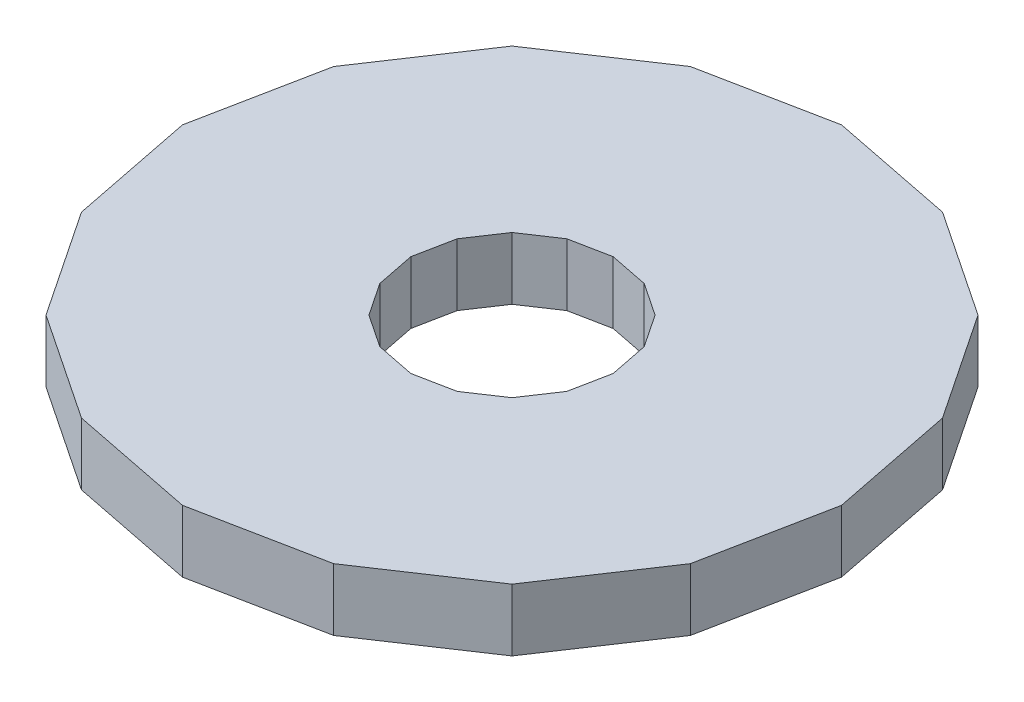
ISO-10303-21;
HEADER;
FILE_DESCRIPTION(('STEP AP214'),'2;1');
FILE_NAME('part.step','',(''),(''),'','','');
FILE_SCHEMA(('AUTOMOTIVE_DESIGN { 1 0 10303 214 1 1 1 1 }'));
ENDSEC;
DATA;
#1=APPLICATION_CONTEXT('core data for automotive mechanical design processes');
#2=APPLICATION_PROTOCOL_DEFINITION('international standard','automotive_design',2000,#1);
#3=PRODUCT_CONTEXT('',#1,'mechanical');
#4=PRODUCT('Part','Part','',(#3));
#5=PRODUCT_RELATED_PRODUCT_CATEGORY('part','',(#4));
#6=PRODUCT_DEFINITION_FORMATION('','',#4);
#7=PRODUCT_DEFINITION_CONTEXT('part definition',#1,'design');
#8=PRODUCT_DEFINITION('design','',#6,#7);
#9=PRODUCT_DEFINITION_SHAPE('','',#8);
#10=(LENGTH_UNIT() NAMED_UNIT(*) SI_UNIT(.MILLI.,.METRE.));
#11=(NAMED_UNIT(*) PLANE_ANGLE_UNIT() SI_UNIT($,.RADIAN.));
#12=(NAMED_UNIT(*) SI_UNIT($,.STERADIAN.) SOLID_ANGLE_UNIT());
#13=UNCERTAINTY_MEASURE_WITH_UNIT(LENGTH_MEASURE(1.E-05),#10,'distance_accuracy_value','');
#14=(GEOMETRIC_REPRESENTATION_CONTEXT(3) GLOBAL_UNCERTAINTY_ASSIGNED_CONTEXT((#13)) GLOBAL_UNIT_ASSIGNED_CONTEXT((#10,
#11,#12)) REPRESENTATION_CONTEXT('',''));
#15=CARTESIAN_POINT('',(0.,0.,0.));
#16=DIRECTION('',(0.,0.,1.));
#17=DIRECTION('',(1.,0.,0.));
#18=AXIS2_PLACEMENT_3D('',#15,#16,#17);
#19=CARTESIAN_POINT('',(0.,19.05,0.));
#20=DIRECTION('',(0.,1.,0.));
#21=DIRECTION('',(0.,0.,1.));
#22=AXIS2_PLACEMENT_3D('',#19,#20,#21);
#23=PLANE('',#22);
#24=DIRECTION('',(0.195090322016117,0.,-0.980785280403233));
#25=VECTOR('',#24,1.);
#26=CARTESIAN_POINT('',(93.2212751998086,19.05,38.6135164894741));
#27=LINE('',#26,#25);
#28=CARTESIAN_POINT('',(93.2212751998086,19.05,38.6135164894741));
#29=VERTEX_POINT('',#28);
#30=CARTESIAN_POINT('',(100.901981177583,19.05,-1.16920370144925E-12));
#31=VERTEX_POINT('',#30);
#32=EDGE_CURVE('E388',#29,#31,#27,.T.);
#33=ORIENTED_EDGE('',*,*,#32,.T.);
#34=DIRECTION('',(-0.19509032201614,0.,-0.980785280403228));
#35=VECTOR('',#34,1.);
#36=CARTESIAN_POINT('',(100.901981177583,19.05,-1.16920370144925E-12));
#37=LINE('',#36,#35);
#38=CARTESIAN_POINT('',(93.2212751998077,19.05,-38.6135164894763));
#39=VERTEX_POINT('',#38);
#40=EDGE_CURVE('E392',#31,#39,#37,.T.);
#41=ORIENTED_EDGE('',*,*,#40,.T.);
#42=DIRECTION('',(-0.555570233019612,0.,-0.831469612302539));
#43=VECTOR('',#42,1.);
#44=CARTESIAN_POINT('',(93.2212751998077,19.05,-38.6135164894763));
#45=LINE('',#44,#43);
#46=CARTESIAN_POINT('',(71.3484751258256,19.05,-71.3484751258272));
#47=VERTEX_POINT('',#46);
#48=EDGE_CURVE('E396',#39,#47,#45,.T.);
#49=ORIENTED_EDGE('',*,*,#48,.T.);
#50=DIRECTION('',(-0.831469612302551,0.,-0.555570233019593));
#51=VECTOR('',#50,1.);
#52=CARTESIAN_POINT('',(71.3484751258256,19.05,-71.3484751258272));
#53=LINE('',#52,#51);
#54=CARTESIAN_POINT('',(38.6135164894742,19.05,-93.2212751998086));
#55=VERTEX_POINT('',#54);
#56=EDGE_CURVE('E398',#47,#55,#53,.T.);
#57=ORIENTED_EDGE('',*,*,#56,.T.);
#58=DIRECTION('',(-0.980785280403233,0.,-0.195090322016117));
#59=VECTOR('',#58,1.);
#60=CARTESIAN_POINT('',(38.6135164894742,19.05,-93.2212751998086));
#61=LINE('',#60,#59);
#62=CARTESIAN_POINT('',(-1.19110857349548E-12,19.05,-100.901981177583));
#63=VERTEX_POINT('',#62);
#64=EDGE_CURVE('E401',#55,#63,#61,.T.);
#65=ORIENTED_EDGE('',*,*,#64,.T.);
#66=DIRECTION('',(-0.980785280403228,0.,0.195090322016139));
#67=VECTOR('',#66,1.);
#68=CARTESIAN_POINT('',(-1.19110857349548E-12,19.05,-100.901981177583));
#69=LINE('',#68,#67);
#70=CARTESIAN_POINT('',(-38.6135164894763,19.05,-93.2212751998077));
#71=VERTEX_POINT('',#70);
#72=EDGE_CURVE('E403',#63,#71,#69,.T.);
#73=ORIENTED_EDGE('',*,*,#72,.T.);
#74=DIRECTION('',(-0.831469612302539,0.,0.555570233019612));
#75=VECTOR('',#74,1.);
#76=CARTESIAN_POINT('',(-38.6135164894763,19.05,-93.2212751998077));
#77=LINE('',#76,#75);
#78=CARTESIAN_POINT('',(-71.3484751258273,19.05,-71.3484751258256));
#79=VERTEX_POINT('',#78);
#80=EDGE_CURVE('E405',#71,#79,#77,.T.);
#81=ORIENTED_EDGE('',*,*,#80,.T.);
#82=DIRECTION('',(-0.555570233019593,0.,0.831469612302552));
#83=VECTOR('',#82,1.);
#84=CARTESIAN_POINT('',(-71.3484751258273,19.05,-71.3484751258256));
#85=LINE('',#84,#83);
#86=CARTESIAN_POINT('',(-93.2212751998086,19.05,-38.6135164894741));
#87=VERTEX_POINT('',#86);
#88=EDGE_CURVE('E407',#79,#87,#85,.T.);
#89=ORIENTED_EDGE('',*,*,#88,.T.);
#90=DIRECTION('',(-0.195090322016117,0.,0.980785280403233));
#91=VECTOR('',#90,1.);
#92=CARTESIAN_POINT('',(-93.2212751998086,19.05,-38.6135164894741));
#93=LINE('',#92,#91);
#94=CARTESIAN_POINT('',(-100.901981177583,19.05,1.17388085276978E-12));
#95=VERTEX_POINT('',#94);
#96=EDGE_CURVE('E409',#87,#95,#93,.T.);
#97=ORIENTED_EDGE('',*,*,#96,.T.);
#98=DIRECTION('',(0.195090322016139,0.,0.980785280403228));
#99=VECTOR('',#98,1.);
#100=CARTESIAN_POINT('',(-100.901981177583,19.05,1.17388085276978E-12));
#101=LINE('',#100,#99);
#102=CARTESIAN_POINT('',(-93.2212751998077,19.05,38.6135164894763));
#103=VERTEX_POINT('',#102);
#104=EDGE_CURVE('E412',#95,#103,#101,.T.);
#105=ORIENTED_EDGE('',*,*,#104,.T.);
#106=DIRECTION('',(0.555570233019612,0.,0.831469612302539));
#107=VECTOR('',#106,1.);
#108=CARTESIAN_POINT('',(-93.2212751998077,19.05,38.6135164894763));
#109=LINE('',#108,#107);
#110=CARTESIAN_POINT('',(-71.3484751258256,19.05,71.3484751258273));
#111=VERTEX_POINT('',#110);
#112=EDGE_CURVE('E414',#103,#111,#109,.T.);
#113=ORIENTED_EDGE('',*,*,#112,.T.);
#114=DIRECTION('',(0.831469612302552,0.,0.555570233019593));
#115=VECTOR('',#114,1.);
#116=CARTESIAN_POINT('',(-71.3484751258256,19.05,71.3484751258273));
#117=LINE('',#116,#115);
#118=CARTESIAN_POINT('',(-38.6135164894741,19.05,93.2212751998086));
#119=VERTEX_POINT('',#118);
#120=EDGE_CURVE('E416',#111,#119,#117,.T.);
#121=ORIENTED_EDGE('',*,*,#120,.T.);
#122=DIRECTION('',(0.980785280403233,0.,0.195090322016117));
#123=VECTOR('',#122,1.);
#124=CARTESIAN_POINT('',(-38.6135164894741,19.05,93.2212751998086));
#125=LINE('',#124,#123);
#126=CARTESIAN_POINT('',(1.13628479833624E-12,19.05,100.901981177583));
#127=VERTEX_POINT('',#126);
#128=EDGE_CURVE('E418',#119,#127,#125,.T.);
#129=ORIENTED_EDGE('',*,*,#128,.T.);
#130=DIRECTION('',(0.980785280403228,0.,-0.19509032201614));
#131=VECTOR('',#130,1.);
#132=CARTESIAN_POINT('',(1.13628479833624E-12,19.05,100.901981177583));
#133=LINE('',#132,#131);
#134=CARTESIAN_POINT('',(38.6135164894763,19.05,93.2212751998078));
#135=VERTEX_POINT('',#134);
#136=EDGE_CURVE('E420',#127,#135,#133,.T.);
#137=ORIENTED_EDGE('',*,*,#136,.T.);
#138=DIRECTION('',(0.831469612302539,0.,-0.555570233019612));
#139=VECTOR('',#138,1.);
#140=CARTESIAN_POINT('',(38.6135164894763,19.05,93.2212751998078));
#141=LINE('',#140,#139);
#142=CARTESIAN_POINT('',(71.3484751258272,19.05,71.3484751258257));
#143=VERTEX_POINT('',#142);
#144=EDGE_CURVE('E423',#135,#143,#141,.T.);
#145=ORIENTED_EDGE('',*,*,#144,.T.);
#146=DIRECTION('',(0.555570233019593,0.,-0.831469612302551));
#147=VECTOR('',#146,1.);
#148=CARTESIAN_POINT('',(71.3484751258272,19.05,71.3484751258257));
#149=LINE('',#148,#147);
#150=EDGE_CURVE('E425',#143,#29,#149,.T.);
#151=ORIENTED_EDGE('',*,*,#150,.T.);
#152=EDGE_LOOP('',(#33,#41,#49,#57,#65,#73,#81,#89,#97,#105,#113,#121,#129,#137,#145,#151));
#153=FACE_BOUND('',#152,.T.);
#154=DIRECTION('',(-0.195090322016139,0.,-0.980785280403228));
#155=VECTOR('',#154,1.);
#156=CARTESIAN_POINT('',(30.9784195476567,19.05,-3.72794111611453E-13));
#157=LINE('',#156,#155);
#158=CARTESIAN_POINT('',(30.9784195476567,19.05,-3.72794111611453E-13));
#159=VERTEX_POINT('',#158);
#160=CARTESIAN_POINT('',(28.6203277696274,19.05,-11.8549279217434));
#161=VERTEX_POINT('',#160);
#162=EDGE_CURVE('E252',#159,#161,#157,.T.);
#163=ORIENTED_EDGE('',*,*,#162,.F.);
#164=DIRECTION('',(0.195090322016117,0.,-0.980785280403233));
#165=VECTOR('',#164,1.);
#166=CARTESIAN_POINT('',(28.6203277696277,19.05,11.8549279217427));
#167=LINE('',#166,#165);
#168=CARTESIAN_POINT('',(28.6203277696277,19.05,11.8549279217427));
#169=VERTEX_POINT('',#168);
#170=EDGE_CURVE('E243',#169,#159,#167,.T.);
#171=ORIENTED_EDGE('',*,*,#170,.F.);
#172=DIRECTION('',(0.555570233019592,0.,-0.831469612302552));
#173=VECTOR('',#172,1.);
#174=CARTESIAN_POINT('',(21.9050505325902,19.05,21.9050505325897));
#175=LINE('',#174,#173);
#176=CARTESIAN_POINT('',(21.9050505325902,19.05,21.9050505325897));
#177=VERTEX_POINT('',#176);
#178=EDGE_CURVE('E299',#177,#169,#175,.T.);
#179=ORIENTED_EDGE('',*,*,#178,.F.);
#180=DIRECTION('',(0.831469612302539,0.,-0.555570233019612));
#181=VECTOR('',#180,1.);
#182=CARTESIAN_POINT('',(11.8549279217434,19.05,28.6203277696274));
#183=LINE('',#182,#181);
#184=CARTESIAN_POINT('',(11.8549279217434,19.05,28.6203277696274));
#185=VERTEX_POINT('',#184);
#186=EDGE_CURVE('E296',#185,#177,#183,.T.);
#187=ORIENTED_EDGE('',*,*,#186,.F.);
#188=DIRECTION('',(0.980785280403228,0.,-0.195090322016139));
#189=VECTOR('',#188,1.);
#190=CARTESIAN_POINT('',(3.68082283316899E-13,19.05,30.9784195476567));
#191=LINE('',#190,#189);
#192=CARTESIAN_POINT('',(3.68082283316899E-13,19.05,30.9784195476567));
#193=VERTEX_POINT('',#192);
#194=EDGE_CURVE('E293',#193,#185,#191,.T.);
#195=ORIENTED_EDGE('',*,*,#194,.F.);
#196=DIRECTION('',(0.980785280403233,0.,0.195090322016117));
#197=VECTOR('',#196,1.);
#198=CARTESIAN_POINT('',(-11.8549279217427,19.05,28.6203277696277));
#199=LINE('',#198,#197);
#200=CARTESIAN_POINT('',(-11.8549279217427,19.05,28.6203277696277));
#201=VERTEX_POINT('',#200);
#202=EDGE_CURVE('E291',#201,#193,#199,.T.);
#203=ORIENTED_EDGE('',*,*,#202,.F.);
#204=DIRECTION('',(0.831469612302552,0.,0.555570233019592));
#205=VECTOR('',#204,1.);
#206=CARTESIAN_POINT('',(-21.9050505325897,19.05,21.9050505325902));
#207=LINE('',#206,#205);
#208=CARTESIAN_POINT('',(-21.9050505325897,19.05,21.9050505325902));
#209=VERTEX_POINT('',#208);
#210=EDGE_CURVE('E288',#209,#201,#207,.T.);
#211=ORIENTED_EDGE('',*,*,#210,.F.);
#212=DIRECTION('',(0.555570233019612,0.,0.831469612302539));
#213=VECTOR('',#212,1.);
#214=CARTESIAN_POINT('',(-28.6203277696274,19.05,11.8549279217434));
#215=LINE('',#214,#213);
#216=CARTESIAN_POINT('',(-28.6203277696274,19.05,11.8549279217434));
#217=VERTEX_POINT('',#216);
#218=EDGE_CURVE('E286',#217,#209,#215,.T.);
#219=ORIENTED_EDGE('',*,*,#218,.F.);
#220=DIRECTION('',(0.19509032201614,0.,0.980785280403228));
#221=VECTOR('',#220,1.);
#222=CARTESIAN_POINT('',(-30.9784195476567,19.05,3.68735028400665E-13));
#223=LINE('',#222,#221);
#224=CARTESIAN_POINT('',(-30.9784195476567,19.05,3.68735028400665E-13));
#225=VERTEX_POINT('',#224);
#226=EDGE_CURVE('E283',#225,#217,#223,.T.);
#227=ORIENTED_EDGE('',*,*,#226,.F.);
#228=DIRECTION('',(-0.195090322016117,0.,0.980785280403233));
#229=VECTOR('',#228,1.);
#230=CARTESIAN_POINT('',(-28.6203277696277,19.05,-11.8549279217427));
#231=LINE('',#230,#229);
#232=CARTESIAN_POINT('',(-28.6203277696277,19.05,-11.8549279217427));
#233=VERTEX_POINT('',#232);
#234=EDGE_CURVE('E281',#233,#225,#231,.T.);
#235=ORIENTED_EDGE('',*,*,#234,.F.);
#236=DIRECTION('',(-0.555570233019592,0.,0.831469612302552));
#237=VECTOR('',#236,1.);
#238=CARTESIAN_POINT('',(-21.9050505325902,19.05,-21.9050505325897));
#239=LINE('',#238,#237);
#240=CARTESIAN_POINT('',(-21.9050505325902,19.05,-21.9050505325897));
#241=VERTEX_POINT('',#240);
#242=EDGE_CURVE('E279',#241,#233,#239,.T.);
#243=ORIENTED_EDGE('',*,*,#242,.F.);
#244=DIRECTION('',(-0.831469612302539,0.,0.555570233019612));
#245=VECTOR('',#244,1.);
#246=CARTESIAN_POINT('',(-11.8549279217434,19.05,-28.6203277696274));
#247=LINE('',#246,#245);
#248=CARTESIAN_POINT('',(-11.8549279217434,19.05,-28.6203277696274));
#249=VERTEX_POINT('',#248);
#250=EDGE_CURVE('E276',#249,#241,#247,.T.);
#251=ORIENTED_EDGE('',*,*,#250,.F.);
#252=DIRECTION('',(-0.980785280403228,0.,0.19509032201614));
#253=VECTOR('',#252,1.);
#254=CARTESIAN_POINT('',(-3.74982741777192E-13,19.05,-30.9784195476567));
#255=LINE('',#254,#253);
#256=CARTESIAN_POINT('',(-3.74982741777192E-13,19.05,-30.9784195476567));
#257=VERTEX_POINT('',#256);
#258=EDGE_CURVE('E274',#257,#249,#255,.T.);
#259=ORIENTED_EDGE('',*,*,#258,.F.);
#260=DIRECTION('',(-0.980785280403233,0.,-0.195090322016117));
#261=VECTOR('',#260,1.);
#262=CARTESIAN_POINT('',(11.8549279217428,19.05,-28.6203277696277));
#263=LINE('',#262,#261);
#264=CARTESIAN_POINT('',(11.8549279217428,19.05,-28.6203277696277));
#265=VERTEX_POINT('',#264);
#266=EDGE_CURVE('E272',#265,#257,#263,.T.);
#267=ORIENTED_EDGE('',*,*,#266,.F.);
#268=DIRECTION('',(-0.831469612302552,0.,-0.555570233019592));
#269=VECTOR('',#268,1.);
#270=CARTESIAN_POINT('',(21.9050505325897,19.05,-21.9050505325902));
#271=LINE('',#270,#269);
#272=CARTESIAN_POINT('',(21.9050505325897,19.05,-21.9050505325902));
#273=VERTEX_POINT('',#272);
#274=EDGE_CURVE('E268',#273,#265,#271,.T.);
#275=ORIENTED_EDGE('',*,*,#274,.F.);
#276=DIRECTION('',(-0.555570233019612,0.,-0.831469612302539));
#277=VECTOR('',#276,1.);
#278=CARTESIAN_POINT('',(28.6203277696274,19.05,-11.8549279217434));
#279=LINE('',#278,#277);
#280=EDGE_CURVE('E266',#161,#273,#279,.T.);
#281=ORIENTED_EDGE('',*,*,#280,.F.);
#282=EDGE_LOOP('',(#163,#171,#179,#187,#195,#203,#211,#219,#227,#235,#243,#251,#259,#267,#275,#281));
#283=FACE_BOUND('',#282,.T.);
#284=ADVANCED_FACE('F34',(#153,#283),#23,.T.);
#285=CARTESIAN_POINT('',(0.,0.,0.));
#286=DIRECTION('',(0.,1.,0.));
#287=DIRECTION('',(0.,0.,1.));
#288=AXIS2_PLACEMENT_3D('',#285,#286,#287);
#289=PLANE('',#288);
#290=DIRECTION('',(0.195090322016117,0.,-0.980785280403233));
#291=VECTOR('',#290,1.);
#292=CARTESIAN_POINT('',(93.2212751998086,0.,38.6135164894741));
#293=LINE('',#292,#291);
#294=CARTESIAN_POINT('',(93.2212751998086,0.,38.6135164894741));
#295=VERTEX_POINT('',#294);
#296=CARTESIAN_POINT('',(100.901981177583,0.,-1.16920370144925E-12));
#297=VERTEX_POINT('',#296);
#298=EDGE_CURVE('E261',#295,#297,#293,.T.);
#299=ORIENTED_EDGE('',*,*,#298,.F.);
#300=DIRECTION('',(0.555570233019593,0.,-0.831469612302551));
#301=VECTOR('',#300,1.);
#302=CARTESIAN_POINT('',(71.3484751258272,0.,71.3484751258257));
#303=LINE('',#302,#301);
#304=CARTESIAN_POINT('',(71.3484751258272,0.,71.3484751258257));
#305=VERTEX_POINT('',#304);
#306=EDGE_CURVE('E393',#305,#295,#303,.T.);
#307=ORIENTED_EDGE('',*,*,#306,.F.);
#308=DIRECTION('',(0.831469612302539,0.,-0.555570233019612));
#309=VECTOR('',#308,1.);
#310=CARTESIAN_POINT('',(38.6135164894763,0.,93.2212751998078));
#311=LINE('',#310,#309);
#312=CARTESIAN_POINT('',(38.6135164894763,0.,93.2212751998078));
#313=VERTEX_POINT('',#312);
#314=EDGE_CURVE('E459',#313,#305,#311,.T.);
#315=ORIENTED_EDGE('',*,*,#314,.F.);
#316=DIRECTION('',(0.980785280403228,0.,-0.19509032201614));
#317=VECTOR('',#316,1.);
#318=CARTESIAN_POINT('',(1.13628479833624E-12,0.,100.901981177583));
#319=LINE('',#318,#317);
#320=CARTESIAN_POINT('',(1.13628479833624E-12,0.,100.901981177583));
#321=VERTEX_POINT('',#320);
#322=EDGE_CURVE('E457',#321,#313,#319,.T.);
#323=ORIENTED_EDGE('',*,*,#322,.F.);
#324=DIRECTION('',(0.980785280403233,0.,0.195090322016117));
#325=VECTOR('',#324,1.);
#326=CARTESIAN_POINT('',(-38.6135164894741,0.,93.2212751998086));
#327=LINE('',#326,#325);
#328=CARTESIAN_POINT('',(-38.6135164894741,0.,93.2212751998086));
#329=VERTEX_POINT('',#328);
#330=EDGE_CURVE('E455',#329,#321,#327,.T.);
#331=ORIENTED_EDGE('',*,*,#330,.F.);
#332=DIRECTION('',(0.831469612302552,0.,0.555570233019593));
#333=VECTOR('',#332,1.);
#334=CARTESIAN_POINT('',(-71.3484751258256,0.,71.3484751258273));
#335=LINE('',#334,#333);
#336=CARTESIAN_POINT('',(-71.3484751258256,0.,71.3484751258273));
#337=VERTEX_POINT('',#336);
#338=EDGE_CURVE('E453',#337,#329,#335,.T.);
#339=ORIENTED_EDGE('',*,*,#338,.F.);
#340=DIRECTION('',(0.555570233019612,0.,0.831469612302539));
#341=VECTOR('',#340,1.);
#342=CARTESIAN_POINT('',(-93.2212751998077,0.,38.6135164894763));
#343=LINE('',#342,#341);
#344=CARTESIAN_POINT('',(-93.2212751998077,0.,38.6135164894763));
#345=VERTEX_POINT('',#344);
#346=EDGE_CURVE('E451',#345,#337,#343,.T.);
#347=ORIENTED_EDGE('',*,*,#346,.F.);
#348=DIRECTION('',(0.195090322016139,0.,0.980785280403228));
#349=VECTOR('',#348,1.);
#350=CARTESIAN_POINT('',(-100.901981177583,0.,1.17388085276978E-12));
#351=LINE('',#350,#349);
#352=CARTESIAN_POINT('',(-100.901981177583,0.,1.17388085276978E-12));
#353=VERTEX_POINT('',#352);
#354=EDGE_CURVE('E449',#353,#345,#351,.T.);
#355=ORIENTED_EDGE('',*,*,#354,.F.);
#356=DIRECTION('',(-0.195090322016117,0.,0.980785280403233));
#357=VECTOR('',#356,1.);
#358=CARTESIAN_POINT('',(-93.2212751998086,0.,-38.6135164894741));
#359=LINE('',#358,#357);
#360=CARTESIAN_POINT('',(-93.2212751998086,0.,-38.6135164894741));
#361=VERTEX_POINT('',#360);
#362=EDGE_CURVE('E447',#361,#353,#359,.T.);
#363=ORIENTED_EDGE('',*,*,#362,.F.);
#364=DIRECTION('',(-0.555570233019593,0.,0.831469612302552));
#365=VECTOR('',#364,1.);
#366=CARTESIAN_POINT('',(-71.3484751258273,0.,-71.3484751258256));
#367=LINE('',#366,#365);
#368=CARTESIAN_POINT('',(-71.3484751258273,0.,-71.3484751258256));
#369=VERTEX_POINT('',#368);
#370=EDGE_CURVE('E444',#369,#361,#367,.T.);
#371=ORIENTED_EDGE('',*,*,#370,.F.);
#372=DIRECTION('',(-0.831469612302539,0.,0.555570233019612));
#373=VECTOR('',#372,1.);
#374=CARTESIAN_POINT('',(-38.6135164894763,0.,-93.2212751998077));
#375=LINE('',#374,#373);
#376=CARTESIAN_POINT('',(-38.6135164894763,0.,-93.2212751998077));
#377=VERTEX_POINT('',#376);
#378=EDGE_CURVE('E442',#377,#369,#375,.T.);
#379=ORIENTED_EDGE('',*,*,#378,.F.);
#380=DIRECTION('',(-0.980785280403228,0.,0.195090322016139));
#381=VECTOR('',#380,1.);
#382=CARTESIAN_POINT('',(-1.19110857349548E-12,0.,-100.901981177583));
#383=LINE('',#382,#381);
#384=CARTESIAN_POINT('',(-1.19110857349548E-12,0.,-100.901981177583));
#385=VERTEX_POINT('',#384);
#386=EDGE_CURVE('E440',#385,#377,#383,.T.);
#387=ORIENTED_EDGE('',*,*,#386,.F.);
#388=DIRECTION('',(-0.980785280403233,0.,-0.195090322016117));
#389=VECTOR('',#388,1.);
#390=CARTESIAN_POINT('',(38.6135164894742,0.,-93.2212751998086));
#391=LINE('',#390,#389);
#392=CARTESIAN_POINT('',(38.6135164894742,0.,-93.2212751998086));
#393=VERTEX_POINT('',#392);
#394=EDGE_CURVE('E438',#393,#385,#391,.T.);
#395=ORIENTED_EDGE('',*,*,#394,.F.);
#396=DIRECTION('',(-0.831469612302551,0.,-0.555570233019593));
#397=VECTOR('',#396,1.);
#398=CARTESIAN_POINT('',(71.3484751258256,0.,-71.3484751258272));
#399=LINE('',#398,#397);
#400=CARTESIAN_POINT('',(71.3484751258256,0.,-71.3484751258272));
#401=VERTEX_POINT('',#400);
#402=EDGE_CURVE('E436',#401,#393,#399,.T.);
#403=ORIENTED_EDGE('',*,*,#402,.F.);
#404=DIRECTION('',(-0.555570233019612,0.,-0.831469612302539));
#405=VECTOR('',#404,1.);
#406=CARTESIAN_POINT('',(93.2212751998077,0.,-38.6135164894763));
#407=LINE('',#406,#405);
#408=CARTESIAN_POINT('',(93.2212751998077,0.,-38.6135164894763));
#409=VERTEX_POINT('',#408);
#410=EDGE_CURVE('E434',#409,#401,#407,.T.);
#411=ORIENTED_EDGE('',*,*,#410,.F.);
#412=DIRECTION('',(-0.19509032201614,0.,-0.980785280403228));
#413=VECTOR('',#412,1.);
#414=CARTESIAN_POINT('',(100.901981177583,0.,-1.16920370144925E-12));
#415=LINE('',#414,#413);
#416=EDGE_CURVE('E431',#297,#409,#415,.T.);
#417=ORIENTED_EDGE('',*,*,#416,.F.);
#418=EDGE_LOOP('',(#299,#307,#315,#323,#331,#339,#347,#355,#363,#371,#379,#387,#395,#403,#411,#417));
#419=FACE_BOUND('',#418,.T.);
#420=DIRECTION('',(0.195090322016117,0.,-0.980785280403233));
#421=VECTOR('',#420,1.);
#422=CARTESIAN_POINT('',(28.6203277696277,0.,11.8549279217427));
#423=LINE('',#422,#421);
#424=CARTESIAN_POINT('',(28.6203277696277,0.,11.8549279217427));
#425=VERTEX_POINT('',#424);
#426=CARTESIAN_POINT('',(30.9784195476567,0.,-3.72794111611453E-13));
#427=VERTEX_POINT('',#426);
#428=EDGE_CURVE('E57',#425,#427,#423,.T.);
#429=ORIENTED_EDGE('',*,*,#428,.T.);
#430=DIRECTION('',(-0.195090322016139,0.,-0.980785280403228));
#431=VECTOR('',#430,1.);
#432=CARTESIAN_POINT('',(30.9784195476567,0.,-3.72794111611453E-13));
#433=LINE('',#432,#431);
#434=CARTESIAN_POINT('',(28.6203277696274,0.,-11.8549279217434));
#435=VERTEX_POINT('',#434);
#436=EDGE_CURVE('E259',#427,#435,#433,.T.);
#437=ORIENTED_EDGE('',*,*,#436,.T.);
#438=DIRECTION('',(-0.555570233019612,0.,-0.831469612302539));
#439=VECTOR('',#438,1.);
#440=CARTESIAN_POINT('',(28.6203277696274,0.,-11.8549279217434));
#441=LINE('',#440,#439);
#442=CARTESIAN_POINT('',(21.9050505325897,0.,-21.9050505325902));
#443=VERTEX_POINT('',#442);
#444=EDGE_CURVE('E304',#435,#443,#441,.T.);
#445=ORIENTED_EDGE('',*,*,#444,.T.);
#446=DIRECTION('',(-0.831469612302552,0.,-0.555570233019592));
#447=VECTOR('',#446,1.);
#448=CARTESIAN_POINT('',(21.9050505325897,0.,-21.9050505325902));
#449=LINE('',#448,#447);
#450=CARTESIAN_POINT('',(11.8549279217428,0.,-28.6203277696277));
#451=VERTEX_POINT('',#450);
#452=EDGE_CURVE('E308',#443,#451,#449,.T.);
#453=ORIENTED_EDGE('',*,*,#452,.T.);
#454=DIRECTION('',(-0.980785280403233,0.,-0.195090322016117));
#455=VECTOR('',#454,1.);
#456=CARTESIAN_POINT('',(11.8549279217428,0.,-28.6203277696277));
#457=LINE('',#456,#455);
#458=CARTESIAN_POINT('',(-3.74982741777192E-13,0.,-30.9784195476567));
#459=VERTEX_POINT('',#458);
#460=EDGE_CURVE('E311',#451,#459,#457,.T.);
#461=ORIENTED_EDGE('',*,*,#460,.T.);
#462=DIRECTION('',(-0.980785280403228,0.,0.19509032201614));
#463=VECTOR('',#462,1.);
#464=CARTESIAN_POINT('',(-3.74982741777192E-13,0.,-30.9784195476567));
#465=LINE('',#464,#463);
#466=CARTESIAN_POINT('',(-11.8549279217434,0.,-28.6203277696274));
#467=VERTEX_POINT('',#466);
#468=EDGE_CURVE('E314',#459,#467,#465,.T.);
#469=ORIENTED_EDGE('',*,*,#468,.T.);
#470=DIRECTION('',(-0.831469612302539,0.,0.555570233019612));
#471=VECTOR('',#470,1.);
#472=CARTESIAN_POINT('',(-11.8549279217434,0.,-28.6203277696274));
#473=LINE('',#472,#471);
#474=CARTESIAN_POINT('',(-21.9050505325902,0.,-21.9050505325897));
#475=VERTEX_POINT('',#474);
#476=EDGE_CURVE('E318',#467,#475,#473,.T.);
#477=ORIENTED_EDGE('',*,*,#476,.T.);
#478=DIRECTION('',(-0.555570233019592,0.,0.831469612302552));
#479=VECTOR('',#478,1.);
#480=CARTESIAN_POINT('',(-21.9050505325902,0.,-21.9050505325897));
#481=LINE('',#480,#479);
#482=CARTESIAN_POINT('',(-28.6203277696277,0.,-11.8549279217427));
#483=VERTEX_POINT('',#482);
#484=EDGE_CURVE('E322',#475,#483,#481,.T.);
#485=ORIENTED_EDGE('',*,*,#484,.T.);
#486=DIRECTION('',(-0.195090322016117,0.,0.980785280403233));
#487=VECTOR('',#486,1.);
#488=CARTESIAN_POINT('',(-28.6203277696277,0.,-11.8549279217427));
#489=LINE('',#488,#487);
#490=CARTESIAN_POINT('',(-30.9784195476567,0.,3.68735028400665E-13));
#491=VERTEX_POINT('',#490);
#492=EDGE_CURVE('E326',#483,#491,#489,.T.);
#493=ORIENTED_EDGE('',*,*,#492,.T.);
#494=DIRECTION('',(0.19509032201614,0.,0.980785280403228));
#495=VECTOR('',#494,1.);
#496=CARTESIAN_POINT('',(-30.9784195476567,0.,3.68735028400665E-13));
#497=LINE('',#496,#495);
#498=CARTESIAN_POINT('',(-28.6203277696274,0.,11.8549279217434));
#499=VERTEX_POINT('',#498);
#500=EDGE_CURVE('E330',#491,#499,#497,.T.);
#501=ORIENTED_EDGE('',*,*,#500,.T.);
#502=DIRECTION('',(0.555570233019612,0.,0.831469612302539));
#503=VECTOR('',#502,1.);
#504=CARTESIAN_POINT('',(-28.6203277696274,0.,11.8549279217434));
#505=LINE('',#504,#503);
#506=CARTESIAN_POINT('',(-21.9050505325897,0.,21.9050505325902));
#507=VERTEX_POINT('',#506);
#508=EDGE_CURVE('E333',#499,#507,#505,.T.);
#509=ORIENTED_EDGE('',*,*,#508,.T.);
#510=DIRECTION('',(0.831469612302552,0.,0.555570233019592));
#511=VECTOR('',#510,1.);
#512=CARTESIAN_POINT('',(-21.9050505325897,0.,21.9050505325902));
#513=LINE('',#512,#511);
#514=CARTESIAN_POINT('',(-11.8549279217427,0.,28.6203277696277));
#515=VERTEX_POINT('',#514);
#516=EDGE_CURVE('E337',#507,#515,#513,.T.);
#517=ORIENTED_EDGE('',*,*,#516,.T.);
#518=DIRECTION('',(0.980785280403233,0.,0.195090322016117));
#519=VECTOR('',#518,1.);
#520=CARTESIAN_POINT('',(-11.8549279217427,0.,28.6203277696277));
#521=LINE('',#520,#519);
#522=CARTESIAN_POINT('',(3.68082283316899E-13,0.,30.9784195476567));
#523=VERTEX_POINT('',#522);
#524=EDGE_CURVE('E341',#515,#523,#521,.T.);
#525=ORIENTED_EDGE('',*,*,#524,.T.);
#526=DIRECTION('',(0.980785280403228,0.,-0.195090322016139));
#527=VECTOR('',#526,1.);
#528=CARTESIAN_POINT('',(3.68082283316899E-13,0.,30.9784195476567));
#529=LINE('',#528,#527);
#530=CARTESIAN_POINT('',(11.8549279217434,0.,28.6203277696274));
#531=VERTEX_POINT('',#530);
#532=EDGE_CURVE('E345',#523,#531,#529,.T.);
#533=ORIENTED_EDGE('',*,*,#532,.T.);
#534=DIRECTION('',(0.831469612302539,0.,-0.555570233019612));
#535=VECTOR('',#534,1.);
#536=CARTESIAN_POINT('',(11.8549279217434,0.,28.6203277696274));
#537=LINE('',#536,#535);
#538=CARTESIAN_POINT('',(21.9050505325902,0.,21.9050505325897));
#539=VERTEX_POINT('',#538);
#540=EDGE_CURVE('E349',#531,#539,#537,.T.);
#541=ORIENTED_EDGE('',*,*,#540,.T.);
#542=DIRECTION('',(0.555570233019592,0.,-0.831469612302552));
#543=VECTOR('',#542,1.);
#544=CARTESIAN_POINT('',(21.9050505325902,0.,21.9050505325897));
#545=LINE('',#544,#543);
#546=EDGE_CURVE('E253',#539,#425,#545,.T.);
#547=ORIENTED_EDGE('',*,*,#546,.T.);
#548=EDGE_LOOP('',(#429,#437,#445,#453,#461,#469,#477,#485,#493,#501,#509,#517,#525,#533,#541,#547));
#549=FACE_BOUND('',#548,.T.);
#550=ADVANCED_FACE('F518',(#419,#549),#289,.F.);
#551=CARTESIAN_POINT('',(93.2212751998086,19.05,38.6135164894741));
#552=DIRECTION('',(-0.980785280403233,0.,-0.195090322016117));
#553=DIRECTION('',(-0.195090322016117,0.,0.980785280403233));
#554=AXIS2_PLACEMENT_3D('',#551,#552,#553);
#555=PLANE('',#554);
#556=ORIENTED_EDGE('',*,*,#298,.T.);
#557=DIRECTION('',(0.,-1.,0.));
#558=VECTOR('',#557,1.);
#559=CARTESIAN_POINT('',(100.901981177583,19.05,-1.16920370144925E-12));
#560=LINE('',#559,#558);
#561=EDGE_CURVE('E11',#31,#297,#560,.T.);
#562=ORIENTED_EDGE('',*,*,#561,.F.);
#563=ORIENTED_EDGE('',*,*,#32,.F.);
#564=DIRECTION('',(0.,-1.,0.));
#565=VECTOR('',#564,1.);
#566=CARTESIAN_POINT('',(93.2212751998086,19.05,38.6135164894741));
#567=LINE('',#566,#565);
#568=EDGE_CURVE('E427',#29,#295,#567,.T.);
#569=ORIENTED_EDGE('',*,*,#568,.T.);
#570=EDGE_LOOP('',(#556,#562,#563,#569));
#571=FACE_BOUND('',#570,.T.);
#572=ADVANCED_FACE('F36',(#571),#555,.F.);
#573=CARTESIAN_POINT('',(100.901981177583,19.05,-1.16920370144925E-12));
#574=DIRECTION('',(-0.980785280403228,0.,0.19509032201614));
#575=DIRECTION('',(0.19509032201614,0.,0.980785280403228));
#576=AXIS2_PLACEMENT_3D('',#573,#574,#575);
#577=PLANE('',#576);
#578=ORIENTED_EDGE('',*,*,#416,.T.);
#579=DIRECTION('',(0.,-1.,0.));
#580=VECTOR('',#579,1.);
#581=CARTESIAN_POINT('',(93.2212751998077,19.05,-38.6135164894763));
#582=LINE('',#581,#580);
#583=EDGE_CURVE('E42',#39,#409,#582,.T.);
#584=ORIENTED_EDGE('',*,*,#583,.F.);
#585=ORIENTED_EDGE('',*,*,#40,.F.);
#586=ORIENTED_EDGE('',*,*,#561,.T.);
#587=EDGE_LOOP('',(#578,#584,#585,#586));
#588=FACE_BOUND('',#587,.T.);
#589=ADVANCED_FACE('F535',(#588),#577,.F.);
#590=CARTESIAN_POINT('',(93.2212751998077,19.05,-38.6135164894763));
#591=DIRECTION('',(-0.831469612302539,0.,0.555570233019612));
#592=DIRECTION('',(0.555570233019612,0.,0.831469612302539));
#593=AXIS2_PLACEMENT_3D('',#590,#591,#592);
#594=PLANE('',#593);
#595=ORIENTED_EDGE('',*,*,#410,.T.);
#596=DIRECTION('',(0.,-1.,0.));
#597=VECTOR('',#596,1.);
#598=CARTESIAN_POINT('',(71.3484751258256,19.05,-71.3484751258272));
#599=LINE('',#598,#597);
#600=EDGE_CURVE('E504',#47,#401,#599,.T.);
#601=ORIENTED_EDGE('',*,*,#600,.F.);
#602=ORIENTED_EDGE('',*,*,#48,.F.);
#603=ORIENTED_EDGE('',*,*,#583,.T.);
#604=EDGE_LOOP('',(#595,#601,#602,#603));
#605=FACE_BOUND('',#604,.T.);
#606=ADVANCED_FACE('F512',(#605),#594,.F.);
#607=CARTESIAN_POINT('',(71.3484751258256,19.05,-71.3484751258272));
#608=DIRECTION('',(-0.555570233019593,0.,0.831469612302552));
#609=DIRECTION('',(0.831469612302552,0.,0.555570233019593));
#610=AXIS2_PLACEMENT_3D('',#607,#608,#609);
#611=PLANE('',#610);
#612=ORIENTED_EDGE('',*,*,#402,.T.);
#613=DIRECTION('',(0.,-1.,0.));
#614=VECTOR('',#613,1.);
#615=CARTESIAN_POINT('',(38.6135164894742,19.05,-93.2212751998086));
#616=LINE('',#615,#614);
#617=EDGE_CURVE('E500',#55,#393,#616,.T.);
#618=ORIENTED_EDGE('',*,*,#617,.F.);
#619=ORIENTED_EDGE('',*,*,#56,.F.);
#620=ORIENTED_EDGE('',*,*,#600,.T.);
#621=EDGE_LOOP('',(#612,#618,#619,#620));
#622=FACE_BOUND('',#621,.T.);
#623=ADVANCED_FACE('F524',(#622),#611,.F.);
#624=CARTESIAN_POINT('',(38.6135164894742,19.05,-93.2212751998086));
#625=DIRECTION('',(-0.195090322016117,0.,0.980785280403233));
#626=DIRECTION('',(0.980785280403233,0.,0.195090322016117));
#627=AXIS2_PLACEMENT_3D('',#624,#625,#626);
#628=PLANE('',#627);
#629=ORIENTED_EDGE('',*,*,#394,.T.);
#630=DIRECTION('',(0.,-1.,0.));
#631=VECTOR('',#630,1.);
#632=CARTESIAN_POINT('',(-1.19110857349548E-12,19.05,-100.901981177583));
#633=LINE('',#632,#631);
#634=EDGE_CURVE('E497',#63,#385,#633,.T.);
#635=ORIENTED_EDGE('',*,*,#634,.F.);
#636=ORIENTED_EDGE('',*,*,#64,.F.);
#637=ORIENTED_EDGE('',*,*,#617,.T.);
#638=EDGE_LOOP('',(#629,#635,#636,#637));
#639=FACE_BOUND('',#638,.T.);
#640=ADVANCED_FACE('F528',(#639),#628,.F.);
#641=CARTESIAN_POINT('',(-1.19110857349548E-12,19.05,-100.901981177583));
#642=DIRECTION('',(0.195090322016139,0.,0.980785280403228));
#643=DIRECTION('',(0.980785280403228,0.,-0.195090322016139));
#644=AXIS2_PLACEMENT_3D('',#641,#642,#643);
#645=PLANE('',#644);
#646=ORIENTED_EDGE('',*,*,#386,.T.);
#647=DIRECTION('',(0.,-1.,0.));
#648=VECTOR('',#647,1.);
#649=CARTESIAN_POINT('',(-38.6135164894763,19.05,-93.2212751998077));
#650=LINE('',#649,#648);
#651=EDGE_CURVE('E494',#71,#377,#650,.T.);
#652=ORIENTED_EDGE('',*,*,#651,.F.);
#653=ORIENTED_EDGE('',*,*,#72,.F.);
#654=ORIENTED_EDGE('',*,*,#634,.T.);
#655=EDGE_LOOP('',(#646,#652,#653,#654));
#656=FACE_BOUND('',#655,.T.);
#657=ADVANCED_FACE('F588',(#656),#645,.F.);
#658=CARTESIAN_POINT('',(-38.6135164894763,19.05,-93.2212751998077));
#659=DIRECTION('',(0.555570233019612,0.,0.831469612302539));
#660=DIRECTION('',(0.831469612302539,0.,-0.555570233019612));
#661=AXIS2_PLACEMENT_3D('',#658,#659,#660);
#662=PLANE('',#661);
#663=ORIENTED_EDGE('',*,*,#378,.T.);
#664=DIRECTION('',(0.,-1.,0.));
#665=VECTOR('',#664,1.);
#666=CARTESIAN_POINT('',(-71.3484751258273,19.05,-71.3484751258256));
#667=LINE('',#666,#665);
#668=EDGE_CURVE('E491',#79,#369,#667,.T.);
#669=ORIENTED_EDGE('',*,*,#668,.F.);
#670=ORIENTED_EDGE('',*,*,#80,.F.);
#671=ORIENTED_EDGE('',*,*,#651,.T.);
#672=EDGE_LOOP('',(#663,#669,#670,#671));
#673=FACE_BOUND('',#672,.T.);
#674=ADVANCED_FACE('F585',(#673),#662,.F.);
#675=CARTESIAN_POINT('',(-71.3484751258273,19.05,-71.3484751258256));
#676=DIRECTION('',(0.831469612302552,0.,0.555570233019593));
#677=DIRECTION('',(0.555570233019593,0.,-0.831469612302552));
#678=AXIS2_PLACEMENT_3D('',#675,#676,#677);
#679=PLANE('',#678);
#680=ORIENTED_EDGE('',*,*,#370,.T.);
#681=DIRECTION('',(0.,-1.,0.));
#682=VECTOR('',#681,1.);
#683=CARTESIAN_POINT('',(-93.2212751998086,19.05,-38.6135164894741));
#684=LINE('',#683,#682);
#685=EDGE_CURVE('E488',#87,#361,#684,.T.);
#686=ORIENTED_EDGE('',*,*,#685,.F.);
#687=ORIENTED_EDGE('',*,*,#88,.F.);
#688=ORIENTED_EDGE('',*,*,#668,.T.);
#689=EDGE_LOOP('',(#680,#686,#687,#688));
#690=FACE_BOUND('',#689,.T.);
#691=ADVANCED_FACE('F581',(#690),#679,.F.);
#692=CARTESIAN_POINT('',(-93.2212751998086,19.05,-38.6135164894741));
#693=DIRECTION('',(0.980785280403233,0.,0.195090322016117));
#694=DIRECTION('',(0.195090322016117,0.,-0.980785280403233));
#695=AXIS2_PLACEMENT_3D('',#692,#693,#694);
#696=PLANE('',#695);
#697=ORIENTED_EDGE('',*,*,#362,.T.);
#698=DIRECTION('',(0.,-1.,0.));
#699=VECTOR('',#698,1.);
#700=CARTESIAN_POINT('',(-100.901981177583,19.05,1.17388085276978E-12));
#701=LINE('',#700,#699);
#702=EDGE_CURVE('E485',#95,#353,#701,.T.);
#703=ORIENTED_EDGE('',*,*,#702,.F.);
#704=ORIENTED_EDGE('',*,*,#96,.F.);
#705=ORIENTED_EDGE('',*,*,#685,.T.);
#706=EDGE_LOOP('',(#697,#703,#704,#705));
#707=FACE_BOUND('',#706,.T.);
#708=ADVANCED_FACE('F577',(#707),#696,.F.);
#709=CARTESIAN_POINT('',(-100.901981177583,19.05,1.17388085276978E-12));
#710=DIRECTION('',(0.980785280403228,0.,-0.195090322016139));
#711=DIRECTION('',(-0.195090322016139,0.,-0.980785280403228));
#712=AXIS2_PLACEMENT_3D('',#709,#710,#711);
#713=PLANE('',#712);
#714=ORIENTED_EDGE('',*,*,#354,.T.);
#715=DIRECTION('',(0.,-1.,0.));
#716=VECTOR('',#715,1.);
#717=CARTESIAN_POINT('',(-93.2212751998077,19.05,38.6135164894763));
#718=LINE('',#717,#716);
#719=EDGE_CURVE('E482',#103,#345,#718,.T.);
#720=ORIENTED_EDGE('',*,*,#719,.F.);
#721=ORIENTED_EDGE('',*,*,#104,.F.);
#722=ORIENTED_EDGE('',*,*,#702,.T.);
#723=EDGE_LOOP('',(#714,#720,#721,#722));
#724=FACE_BOUND('',#723,.T.);
#725=ADVANCED_FACE('F572',(#724),#713,.F.);
#726=CARTESIAN_POINT('',(-93.2212751998077,19.05,38.6135164894763));
#727=DIRECTION('',(0.831469612302539,0.,-0.555570233019612));
#728=DIRECTION('',(-0.555570233019612,0.,-0.831469612302539));
#729=AXIS2_PLACEMENT_3D('',#726,#727,#728);
#730=PLANE('',#729);
#731=ORIENTED_EDGE('',*,*,#346,.T.);
#732=DIRECTION('',(0.,-1.,0.));
#733=VECTOR('',#732,1.);
#734=CARTESIAN_POINT('',(-71.3484751258256,19.05,71.3484751258273));
#735=LINE('',#734,#733);
#736=EDGE_CURVE('E479',#111,#337,#735,.T.);
#737=ORIENTED_EDGE('',*,*,#736,.F.);
#738=ORIENTED_EDGE('',*,*,#112,.F.);
#739=ORIENTED_EDGE('',*,*,#719,.T.);
#740=EDGE_LOOP('',(#731,#737,#738,#739));
#741=FACE_BOUND('',#740,.T.);
#742=ADVANCED_FACE('F566',(#741),#730,.F.);
#743=CARTESIAN_POINT('',(-71.3484751258256,19.05,71.3484751258273));
#744=DIRECTION('',(0.555570233019593,0.,-0.831469612302552));
#745=DIRECTION('',(-0.831469612302552,0.,-0.555570233019593));
#746=AXIS2_PLACEMENT_3D('',#743,#744,#745);
#747=PLANE('',#746);
#748=ORIENTED_EDGE('',*,*,#338,.T.);
#749=DIRECTION('',(0.,-1.,0.));
#750=VECTOR('',#749,1.);
#751=CARTESIAN_POINT('',(-38.6135164894741,19.05,93.2212751998086));
#752=LINE('',#751,#750);
#753=EDGE_CURVE('E475',#119,#329,#752,.T.);
#754=ORIENTED_EDGE('',*,*,#753,.F.);
#755=ORIENTED_EDGE('',*,*,#120,.F.);
#756=ORIENTED_EDGE('',*,*,#736,.T.);
#757=EDGE_LOOP('',(#748,#754,#755,#756));
#758=FACE_BOUND('',#757,.T.);
#759=ADVANCED_FACE('F562',(#758),#747,.F.);
#760=CARTESIAN_POINT('',(-38.6135164894741,19.05,93.2212751998086));
#761=DIRECTION('',(0.195090322016117,0.,-0.980785280403233));
#762=DIRECTION('',(-0.980785280403233,0.,-0.195090322016117));
#763=AXIS2_PLACEMENT_3D('',#760,#761,#762);
#764=PLANE('',#763);
#765=ORIENTED_EDGE('',*,*,#330,.T.);
#766=DIRECTION('',(0.,-1.,0.));
#767=VECTOR('',#766,1.);
#768=CARTESIAN_POINT('',(1.13628479833624E-12,19.05,100.901981177583));
#769=LINE('',#768,#767);
#770=EDGE_CURVE('E471',#127,#321,#769,.T.);
#771=ORIENTED_EDGE('',*,*,#770,.F.);
#772=ORIENTED_EDGE('',*,*,#128,.F.);
#773=ORIENTED_EDGE('',*,*,#753,.T.);
#774=EDGE_LOOP('',(#765,#771,#772,#773));
#775=FACE_BOUND('',#774,.T.);
#776=ADVANCED_FACE('F557',(#775),#764,.F.);
#777=CARTESIAN_POINT('',(1.13628479833624E-12,19.05,100.901981177583));
#778=DIRECTION('',(-0.19509032201614,0.,-0.980785280403228));
#779=DIRECTION('',(-0.980785280403228,0.,0.19509032201614));
#780=AXIS2_PLACEMENT_3D('',#777,#778,#779);
#781=PLANE('',#780);
#782=ORIENTED_EDGE('',*,*,#322,.T.);
#783=DIRECTION('',(0.,-1.,0.));
#784=VECTOR('',#783,1.);
#785=CARTESIAN_POINT('',(38.6135164894763,19.05,93.2212751998078));
#786=LINE('',#785,#784);
#787=EDGE_CURVE('E467',#135,#313,#786,.T.);
#788=ORIENTED_EDGE('',*,*,#787,.F.);
#789=ORIENTED_EDGE('',*,*,#136,.F.);
#790=ORIENTED_EDGE('',*,*,#770,.T.);
#791=EDGE_LOOP('',(#782,#788,#789,#790));
#792=FACE_BOUND('',#791,.T.);
#793=ADVANCED_FACE('F551',(#792),#781,.F.);
#794=CARTESIAN_POINT('',(38.6135164894763,19.05,93.2212751998078));
#795=DIRECTION('',(-0.555570233019612,0.,-0.831469612302539));
#796=DIRECTION('',(-0.831469612302539,0.,0.555570233019612));
#797=AXIS2_PLACEMENT_3D('',#794,#795,#796);
#798=PLANE('',#797);
#799=ORIENTED_EDGE('',*,*,#314,.T.);
#800=DIRECTION('',(0.,-1.,0.));
#801=VECTOR('',#800,1.);
#802=CARTESIAN_POINT('',(71.3484751258272,19.05,71.3484751258257));
#803=LINE('',#802,#801);
#804=EDGE_CURVE('E464',#143,#305,#803,.T.);
#805=ORIENTED_EDGE('',*,*,#804,.F.);
#806=ORIENTED_EDGE('',*,*,#144,.F.);
#807=ORIENTED_EDGE('',*,*,#787,.T.);
#808=EDGE_LOOP('',(#799,#805,#806,#807));
#809=FACE_BOUND('',#808,.T.);
#810=ADVANCED_FACE('F547',(#809),#798,.F.);
#811=CARTESIAN_POINT('',(71.3484751258272,19.05,71.3484751258257));
#812=DIRECTION('',(-0.831469612302551,0.,-0.555570233019593));
#813=DIRECTION('',(-0.555570233019593,0.,0.831469612302552));
#814=AXIS2_PLACEMENT_3D('',#811,#812,#813);
#815=PLANE('',#814);
#816=ORIENTED_EDGE('',*,*,#306,.T.);
#817=ORIENTED_EDGE('',*,*,#568,.F.);
#818=ORIENTED_EDGE('',*,*,#150,.F.);
#819=ORIENTED_EDGE('',*,*,#804,.T.);
#820=EDGE_LOOP('',(#816,#817,#818,#819));
#821=FACE_BOUND('',#820,.T.);
#822=ADVANCED_FACE('F542',(#821),#815,.F.);
#823=CARTESIAN_POINT('',(28.6203277696277,19.05,11.8549279217427));
#824=DIRECTION('',(-0.980785280403233,0.,-0.195090322016117));
#825=DIRECTION('',(-0.195090322016117,0.,0.980785280403233));
#826=AXIS2_PLACEMENT_3D('',#823,#824,#825);
#827=PLANE('',#826);
#828=ORIENTED_EDGE('',*,*,#428,.F.);
#829=DIRECTION('',(0.,-1.,0.));
#830=VECTOR('',#829,1.);
#831=CARTESIAN_POINT('',(28.6203277696277,19.05,11.8549279217427));
#832=LINE('',#831,#830);
#833=EDGE_CURVE('E247',#169,#425,#832,.T.);
#834=ORIENTED_EDGE('',*,*,#833,.F.);
#835=ORIENTED_EDGE('',*,*,#170,.T.);
#836=DIRECTION('',(0.,-1.,0.));
#837=VECTOR('',#836,1.);
#838=CARTESIAN_POINT('',(30.9784195476567,19.05,-3.72794111611453E-13));
#839=LINE('',#838,#837);
#840=EDGE_CURVE('E246',#159,#427,#839,.T.);
#841=ORIENTED_EDGE('',*,*,#840,.T.);
#842=EDGE_LOOP('',(#828,#834,#835,#841));
#843=FACE_BOUND('',#842,.T.);
#844=ADVANCED_FACE('F245',(#843),#827,.T.);
#845=CARTESIAN_POINT('',(30.9784195476567,19.05,-3.72794111611453E-13));
#846=DIRECTION('',(-0.980785280403228,0.,0.195090322016139));
#847=DIRECTION('',(0.195090322016139,0.,0.980785280403228));
#848=AXIS2_PLACEMENT_3D('',#845,#846,#847);
#849=PLANE('',#848);
#850=ORIENTED_EDGE('',*,*,#436,.F.);
#851=ORIENTED_EDGE('',*,*,#840,.F.);
#852=ORIENTED_EDGE('',*,*,#162,.T.);
#853=DIRECTION('',(0.,-1.,0.));
#854=VECTOR('',#853,1.);
#855=CARTESIAN_POINT('',(28.6203277696274,19.05,-11.8549279217434));
#856=LINE('',#855,#854);
#857=EDGE_CURVE('E262',#161,#435,#856,.T.);
#858=ORIENTED_EDGE('',*,*,#857,.T.);
#859=EDGE_LOOP('',(#850,#851,#852,#858));
#860=FACE_BOUND('',#859,.T.);
#861=ADVANCED_FACE('F256',(#860),#849,.T.);
#862=CARTESIAN_POINT('',(28.6203277696274,19.05,-11.8549279217434));
#863=DIRECTION('',(-0.831469612302539,0.,0.555570233019612));
#864=DIRECTION('',(0.555570233019612,0.,0.831469612302539));
#865=AXIS2_PLACEMENT_3D('',#862,#863,#864);
#866=PLANE('',#865);
#867=ORIENTED_EDGE('',*,*,#444,.F.);
#868=ORIENTED_EDGE('',*,*,#857,.F.);
#869=ORIENTED_EDGE('',*,*,#280,.T.);
#870=DIRECTION('',(0.,-1.,0.));
#871=VECTOR('',#870,1.);
#872=CARTESIAN_POINT('',(21.9050505325897,19.05,-21.9050505325902));
#873=LINE('',#872,#871);
#874=EDGE_CURVE('E384',#273,#443,#873,.T.);
#875=ORIENTED_EDGE('',*,*,#874,.T.);
#876=EDGE_LOOP('',(#867,#868,#869,#875));
#877=FACE_BOUND('',#876,.T.);
#878=ADVANCED_FACE('F670',(#877),#866,.T.);
#879=CARTESIAN_POINT('',(21.9050505325897,19.05,-21.9050505325902));
#880=DIRECTION('',(-0.555570233019592,0.,0.831469612302552));
#881=DIRECTION('',(0.831469612302552,0.,0.555570233019592));
#882=AXIS2_PLACEMENT_3D('',#879,#880,#881);
#883=PLANE('',#882);
#884=ORIENTED_EDGE('',*,*,#452,.F.);
#885=ORIENTED_EDGE('',*,*,#874,.F.);
#886=ORIENTED_EDGE('',*,*,#274,.T.);
#887=DIRECTION('',(0.,-1.,0.));
#888=VECTOR('',#887,1.);
#889=CARTESIAN_POINT('',(11.8549279217428,19.05,-28.6203277696277));
#890=LINE('',#889,#888);
#891=EDGE_CURVE('E382',#265,#451,#890,.T.);
#892=ORIENTED_EDGE('',*,*,#891,.T.);
#893=EDGE_LOOP('',(#884,#885,#886,#892));
#894=FACE_BOUND('',#893,.T.);
#895=ADVANCED_FACE('F676',(#894),#883,.T.);
#896=CARTESIAN_POINT('',(11.8549279217428,19.05,-28.6203277696277));
#897=DIRECTION('',(-0.195090322016117,0.,0.980785280403233));
#898=DIRECTION('',(0.980785280403233,0.,0.195090322016117));
#899=AXIS2_PLACEMENT_3D('',#896,#897,#898);
#900=PLANE('',#899);
#901=ORIENTED_EDGE('',*,*,#460,.F.);
#902=ORIENTED_EDGE('',*,*,#891,.F.);
#903=ORIENTED_EDGE('',*,*,#266,.T.);
#904=DIRECTION('',(0.,-1.,0.));
#905=VECTOR('',#904,1.);
#906=CARTESIAN_POINT('',(-3.74982741777192E-13,19.05,-30.9784195476567));
#907=LINE('',#906,#905);
#908=EDGE_CURVE('E380',#257,#459,#907,.T.);
#909=ORIENTED_EDGE('',*,*,#908,.T.);
#910=EDGE_LOOP('',(#901,#902,#903,#909));
#911=FACE_BOUND('',#910,.T.);
#912=ADVANCED_FACE('F684',(#911),#900,.T.);
#913=CARTESIAN_POINT('',(-3.74982741777192E-13,19.05,-30.9784195476567));
#914=DIRECTION('',(0.19509032201614,0.,0.980785280403228));
#915=DIRECTION('',(0.980785280403228,0.,-0.19509032201614));
#916=AXIS2_PLACEMENT_3D('',#913,#914,#915);
#917=PLANE('',#916);
#918=ORIENTED_EDGE('',*,*,#468,.F.);
#919=ORIENTED_EDGE('',*,*,#908,.F.);
#920=ORIENTED_EDGE('',*,*,#258,.T.);
#921=DIRECTION('',(0.,-1.,0.));
#922=VECTOR('',#921,1.);
#923=CARTESIAN_POINT('',(-11.8549279217434,19.05,-28.6203277696274));
#924=LINE('',#923,#922);
#925=EDGE_CURVE('E378',#249,#467,#924,.T.);
#926=ORIENTED_EDGE('',*,*,#925,.T.);
#927=EDGE_LOOP('',(#918,#919,#920,#926));
#928=FACE_BOUND('',#927,.T.);
#929=ADVANCED_FACE('F692',(#928),#917,.T.);
#930=CARTESIAN_POINT('',(-11.8549279217434,19.05,-28.6203277696274));
#931=DIRECTION('',(0.555570233019612,0.,0.831469612302539));
#932=DIRECTION('',(0.831469612302539,0.,-0.555570233019612));
#933=AXIS2_PLACEMENT_3D('',#930,#931,#932);
#934=PLANE('',#933);
#935=ORIENTED_EDGE('',*,*,#476,.F.);
#936=ORIENTED_EDGE('',*,*,#925,.F.);
#937=ORIENTED_EDGE('',*,*,#250,.T.);
#938=DIRECTION('',(0.,-1.,0.));
#939=VECTOR('',#938,1.);
#940=CARTESIAN_POINT('',(-21.9050505325902,19.05,-21.9050505325897));
#941=LINE('',#940,#939);
#942=EDGE_CURVE('E376',#241,#475,#941,.T.);
#943=ORIENTED_EDGE('',*,*,#942,.T.);
#944=EDGE_LOOP('',(#935,#936,#937,#943));
#945=FACE_BOUND('',#944,.T.);
#946=ADVANCED_FACE('F700',(#945),#934,.T.);
#947=CARTESIAN_POINT('',(-21.9050505325902,19.05,-21.9050505325897));
#948=DIRECTION('',(0.831469612302552,0.,0.555570233019592));
#949=DIRECTION('',(0.555570233019592,0.,-0.831469612302552));
#950=AXIS2_PLACEMENT_3D('',#947,#948,#949);
#951=PLANE('',#950);
#952=ORIENTED_EDGE('',*,*,#484,.F.);
#953=ORIENTED_EDGE('',*,*,#942,.F.);
#954=ORIENTED_EDGE('',*,*,#242,.T.);
#955=DIRECTION('',(0.,-1.,0.));
#956=VECTOR('',#955,1.);
#957=CARTESIAN_POINT('',(-28.6203277696277,19.05,-11.8549279217427));
#958=LINE('',#957,#956);
#959=EDGE_CURVE('E373',#233,#483,#958,.T.);
#960=ORIENTED_EDGE('',*,*,#959,.T.);
#961=EDGE_LOOP('',(#952,#953,#954,#960));
#962=FACE_BOUND('',#961,.T.);
#963=ADVANCED_FACE('F709',(#962),#951,.T.);
#964=CARTESIAN_POINT('',(-28.6203277696277,19.05,-11.8549279217427));
#965=DIRECTION('',(0.980785280403233,0.,0.195090322016117));
#966=DIRECTION('',(0.195090322016117,0.,-0.980785280403233));
#967=AXIS2_PLACEMENT_3D('',#964,#965,#966);
#968=PLANE('',#967);
#969=ORIENTED_EDGE('',*,*,#492,.F.);
#970=ORIENTED_EDGE('',*,*,#959,.F.);
#971=ORIENTED_EDGE('',*,*,#234,.T.);
#972=DIRECTION('',(0.,-1.,0.));
#973=VECTOR('',#972,1.);
#974=CARTESIAN_POINT('',(-30.9784195476567,19.05,3.68735028400665E-13));
#975=LINE('',#974,#973);
#976=EDGE_CURVE('E370',#225,#491,#975,.T.);
#977=ORIENTED_EDGE('',*,*,#976,.T.);
#978=EDGE_LOOP('',(#969,#970,#971,#977));
#979=FACE_BOUND('',#978,.T.);
#980=ADVANCED_FACE('F717',(#979),#968,.T.);
#981=CARTESIAN_POINT('',(-30.9784195476567,19.05,3.68735028400665E-13));
#982=DIRECTION('',(0.980785280403228,0.,-0.19509032201614));
#983=DIRECTION('',(-0.19509032201614,0.,-0.980785280403228));
#984=AXIS2_PLACEMENT_3D('',#981,#982,#983);
#985=PLANE('',#984);
#986=ORIENTED_EDGE('',*,*,#500,.F.);
#987=ORIENTED_EDGE('',*,*,#976,.F.);
#988=ORIENTED_EDGE('',*,*,#226,.T.);
#989=DIRECTION('',(0.,-1.,0.));
#990=VECTOR('',#989,1.);
#991=CARTESIAN_POINT('',(-28.6203277696274,19.05,11.8549279217434));
#992=LINE('',#991,#990);
#993=EDGE_CURVE('E367',#217,#499,#992,.T.);
#994=ORIENTED_EDGE('',*,*,#993,.T.);
#995=EDGE_LOOP('',(#986,#987,#988,#994));
#996=FACE_BOUND('',#995,.T.);
#997=ADVANCED_FACE('F725',(#996),#985,.T.);
#998=CARTESIAN_POINT('',(-28.6203277696274,19.05,11.8549279217434));
#999=DIRECTION('',(0.831469612302539,0.,-0.555570233019612));
#1000=DIRECTION('',(-0.555570233019612,0.,-0.831469612302539));
#1001=AXIS2_PLACEMENT_3D('',#998,#999,#1000);
#1002=PLANE('',#1001);
#1003=ORIENTED_EDGE('',*,*,#508,.F.);
#1004=ORIENTED_EDGE('',*,*,#993,.F.);
#1005=ORIENTED_EDGE('',*,*,#218,.T.);
#1006=DIRECTION('',(0.,-1.,0.));
#1007=VECTOR('',#1006,1.);
#1008=CARTESIAN_POINT('',(-21.9050505325897,19.05,21.9050505325902));
#1009=LINE('',#1008,#1007);
#1010=EDGE_CURVE('E364',#209,#507,#1009,.T.);
#1011=ORIENTED_EDGE('',*,*,#1010,.T.);
#1012=EDGE_LOOP('',(#1003,#1004,#1005,#1011));
#1013=FACE_BOUND('',#1012,.T.);
#1014=ADVANCED_FACE('F733',(#1013),#1002,.T.);
#1015=CARTESIAN_POINT('',(-21.9050505325897,19.05,21.9050505325902));
#1016=DIRECTION('',(0.555570233019592,0.,-0.831469612302552));
#1017=DIRECTION('',(-0.831469612302552,0.,-0.555570233019592));
#1018=AXIS2_PLACEMENT_3D('',#1015,#1016,#1017);
#1019=PLANE('',#1018);
#1020=ORIENTED_EDGE('',*,*,#516,.F.);
#1021=ORIENTED_EDGE('',*,*,#1010,.F.);
#1022=ORIENTED_EDGE('',*,*,#210,.T.);
#1023=DIRECTION('',(0.,-1.,0.));
#1024=VECTOR('',#1023,1.);
#1025=CARTESIAN_POINT('',(-11.8549279217427,19.05,28.6203277696277));
#1026=LINE('',#1025,#1024);
#1027=EDGE_CURVE('E362',#201,#515,#1026,.T.);
#1028=ORIENTED_EDGE('',*,*,#1027,.T.);
#1029=EDGE_LOOP('',(#1020,#1021,#1022,#1028));
#1030=FACE_BOUND('',#1029,.T.);
#1031=ADVANCED_FACE('F741',(#1030),#1019,.T.);
#1032=CARTESIAN_POINT('',(-11.8549279217427,19.05,28.6203277696277));
#1033=DIRECTION('',(0.195090322016117,0.,-0.980785280403233));
#1034=DIRECTION('',(-0.980785280403233,0.,-0.195090322016117));
#1035=AXIS2_PLACEMENT_3D('',#1032,#1033,#1034);
#1036=PLANE('',#1035);
#1037=ORIENTED_EDGE('',*,*,#524,.F.);
#1038=ORIENTED_EDGE('',*,*,#1027,.F.);
#1039=ORIENTED_EDGE('',*,*,#202,.T.);
#1040=DIRECTION('',(0.,-1.,0.));
#1041=VECTOR('',#1040,1.);
#1042=CARTESIAN_POINT('',(3.68082283316899E-13,19.05,30.9784195476567));
#1043=LINE('',#1042,#1041);
#1044=EDGE_CURVE('E360',#193,#523,#1043,.T.);
#1045=ORIENTED_EDGE('',*,*,#1044,.T.);
#1046=EDGE_LOOP('',(#1037,#1038,#1039,#1045));
#1047=FACE_BOUND('',#1046,.T.);
#1048=ADVANCED_FACE('F749',(#1047),#1036,.T.);
#1049=CARTESIAN_POINT('',(3.68082283316899E-13,19.05,30.9784195476567));
#1050=DIRECTION('',(-0.195090322016139,0.,-0.980785280403228));
#1051=DIRECTION('',(-0.980785280403228,0.,0.195090322016139));
#1052=AXIS2_PLACEMENT_3D('',#1049,#1050,#1051);
#1053=PLANE('',#1052);
#1054=ORIENTED_EDGE('',*,*,#532,.F.);
#1055=ORIENTED_EDGE('',*,*,#1044,.F.);
#1056=ORIENTED_EDGE('',*,*,#194,.T.);
#1057=DIRECTION('',(0.,-1.,0.));
#1058=VECTOR('',#1057,1.);
#1059=CARTESIAN_POINT('',(11.8549279217434,19.05,28.6203277696274));
#1060=LINE('',#1059,#1058);
#1061=EDGE_CURVE('E358',#185,#531,#1060,.T.);
#1062=ORIENTED_EDGE('',*,*,#1061,.T.);
#1063=EDGE_LOOP('',(#1054,#1055,#1056,#1062));
#1064=FACE_BOUND('',#1063,.T.);
#1065=ADVANCED_FACE('F757',(#1064),#1053,.T.);
#1066=CARTESIAN_POINT('',(11.8549279217434,19.05,28.6203277696274));
#1067=DIRECTION('',(-0.555570233019612,0.,-0.831469612302539));
#1068=DIRECTION('',(-0.831469612302539,0.,0.555570233019612));
#1069=AXIS2_PLACEMENT_3D('',#1066,#1067,#1068);
#1070=PLANE('',#1069);
#1071=ORIENTED_EDGE('',*,*,#540,.F.);
#1072=ORIENTED_EDGE('',*,*,#1061,.F.);
#1073=ORIENTED_EDGE('',*,*,#186,.T.);
#1074=DIRECTION('',(0.,-1.,0.));
#1075=VECTOR('',#1074,1.);
#1076=CARTESIAN_POINT('',(21.9050505325902,19.05,21.9050505325897));
#1077=LINE('',#1076,#1075);
#1078=EDGE_CURVE('E49',#177,#539,#1077,.T.);
#1079=ORIENTED_EDGE('',*,*,#1078,.T.);
#1080=EDGE_LOOP('',(#1071,#1072,#1073,#1079));
#1081=FACE_BOUND('',#1080,.T.);
#1082=ADVANCED_FACE('F765',(#1081),#1070,.T.);
#1083=CARTESIAN_POINT('',(21.9050505325902,19.05,21.9050505325897));
#1084=DIRECTION('',(-0.831469612302552,0.,-0.555570233019592));
#1085=DIRECTION('',(-0.555570233019592,0.,0.831469612302552));
#1086=AXIS2_PLACEMENT_3D('',#1083,#1084,#1085);
#1087=PLANE('',#1086);
#1088=ORIENTED_EDGE('',*,*,#546,.F.);
#1089=ORIENTED_EDGE('',*,*,#1078,.F.);
#1090=ORIENTED_EDGE('',*,*,#178,.T.);
#1091=ORIENTED_EDGE('',*,*,#833,.T.);
#1092=EDGE_LOOP('',(#1088,#1089,#1090,#1091));
#1093=FACE_BOUND('',#1092,.T.);
#1094=ADVANCED_FACE('F773',(#1093),#1087,.T.);
#1095=CLOSED_SHELL('',(#284,#550,#572,#589,#606,#623,#640,#657,#674,#691,#708,#725,#742,#759,
#776,#793,#810,#822,#844,#861,#878,#895,#912,#929,#946,#963,#980,#997,#1014,#1031,#1048,#1065,
#1082,#1094));
#1096=MANIFOLD_SOLID_BREP('B2',#1095);
#1097=ADVANCED_BREP_SHAPE_REPRESENTATION('',(#18,#1096),#14);
#1098=SHAPE_DEFINITION_REPRESENTATION(#9,#1097);
ENDSEC;
END-ISO-10303-21;
